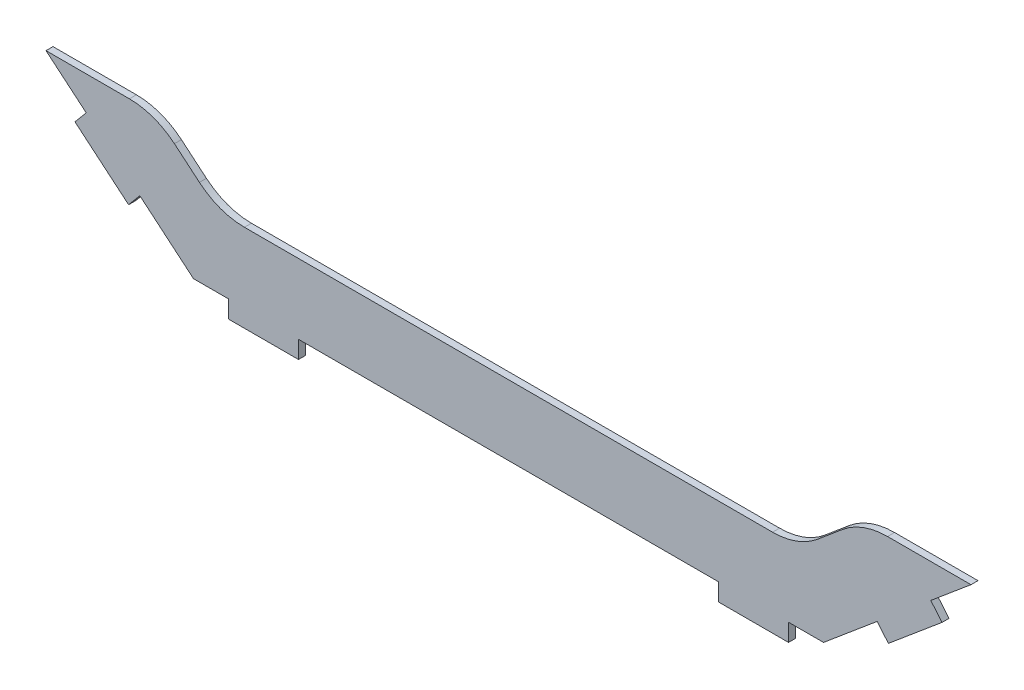
ISO-10303-21;
HEADER;
FILE_DESCRIPTION(('STEP AP214'),'2;1');
FILE_NAME('part.step','',(''),(''),'','','');
FILE_SCHEMA(('AUTOMOTIVE_DESIGN { 1 0 10303 214 1 1 1 1 }'));
ENDSEC;
DATA;
#1=APPLICATION_CONTEXT('core data for automotive mechanical design processes');
#2=APPLICATION_PROTOCOL_DEFINITION('international standard','automotive_design',2000,#1);
#3=PRODUCT_CONTEXT('',#1,'mechanical');
#4=PRODUCT('Part','Part','',(#3));
#5=PRODUCT_RELATED_PRODUCT_CATEGORY('part','',(#4));
#6=PRODUCT_DEFINITION_FORMATION('','',#4);
#7=PRODUCT_DEFINITION_CONTEXT('part definition',#1,'design');
#8=PRODUCT_DEFINITION('design','',#6,#7);
#9=PRODUCT_DEFINITION_SHAPE('','',#8);
#10=(LENGTH_UNIT() NAMED_UNIT(*) SI_UNIT(.MILLI.,.METRE.));
#11=(NAMED_UNIT(*) PLANE_ANGLE_UNIT() SI_UNIT($,.RADIAN.));
#12=(NAMED_UNIT(*) SI_UNIT($,.STERADIAN.) SOLID_ANGLE_UNIT());
#13=UNCERTAINTY_MEASURE_WITH_UNIT(LENGTH_MEASURE(1.E-05),#10,'distance_accuracy_value','');
#14=(GEOMETRIC_REPRESENTATION_CONTEXT(3) GLOBAL_UNCERTAINTY_ASSIGNED_CONTEXT((#13)) GLOBAL_UNIT_ASSIGNED_CONTEXT((#10,
#11,#12)) REPRESENTATION_CONTEXT('',''));
#15=CARTESIAN_POINT('',(0.,0.,0.));
#16=DIRECTION('',(0.,0.,1.));
#17=DIRECTION('',(1.,0.,0.));
#18=AXIS2_PLACEMENT_3D('',#15,#16,#17);
#19=CARTESIAN_POINT('',(0.,0.,0.05));
#20=DIRECTION('',(0.,1.,0.));
#21=DIRECTION('',(0.,0.,1.));
#22=AXIS2_PLACEMENT_3D('',#19,#20,#21);
#23=PLANE('',#22);
#24=DIRECTION('',(1.,0.,0.));
#25=VECTOR('',#24,1.);
#26=CARTESIAN_POINT('',(0.,0.,-0.05));
#27=LINE('',#26,#25);
#28=CARTESIAN_POINT('',(-3.,0.,-0.05));
#29=VERTEX_POINT('',#28);
#30=CARTESIAN_POINT('',(3.,0.,-0.05));
#31=VERTEX_POINT('',#30);
#32=EDGE_CURVE('E277',#29,#31,#27,.T.);
#33=ORIENTED_EDGE('',*,*,#32,.T.);
#34=DIRECTION('',(0.,0.,-1.));
#35=VECTOR('',#34,1.);
#36=CARTESIAN_POINT('',(3.,0.,0.05));
#37=LINE('',#36,#35);
#38=CARTESIAN_POINT('',(3.,0.,0.05));
#39=VERTEX_POINT('',#38);
#40=EDGE_CURVE('E276',#39,#31,#37,.T.);
#41=ORIENTED_EDGE('',*,*,#40,.F.);
#42=DIRECTION('',(1.,0.,0.));
#43=VECTOR('',#42,1.);
#44=CARTESIAN_POINT('',(0.,0.,0.05));
#45=LINE('',#44,#43);
#46=CARTESIAN_POINT('',(-3.,0.,0.05));
#47=VERTEX_POINT('',#46);
#48=EDGE_CURVE('E260',#47,#39,#45,.T.);
#49=ORIENTED_EDGE('',*,*,#48,.F.);
#50=DIRECTION('',(0.,0.,-1.));
#51=VECTOR('',#50,1.);
#52=CARTESIAN_POINT('',(-3.,0.,0.05));
#53=LINE('',#52,#51);
#54=EDGE_CURVE('E350',#47,#29,#53,.T.);
#55=ORIENTED_EDGE('',*,*,#54,.T.);
#56=EDGE_LOOP('',(#33,#41,#49,#55));
#57=FACE_BOUND('',#56,.T.);
#58=ADVANCED_FACE('F39',(#57),#23,.F.);
#59=CARTESIAN_POINT('',(3.,0.,0.05));
#60=DIRECTION('',(1.,0.,0.));
#61=DIRECTION('',(0.,0.,-1.));
#62=AXIS2_PLACEMENT_3D('',#59,#60,#61);
#63=PLANE('',#62);
#64=DIRECTION('',(0.,-1.,0.));
#65=VECTOR('',#64,1.);
#66=CARTESIAN_POINT('',(3.,0.,-0.05));
#67=LINE('',#66,#65);
#68=CARTESIAN_POINT('',(3.,-0.25,-0.05));
#69=VERTEX_POINT('',#68);
#70=EDGE_CURVE('E353',#31,#69,#67,.T.);
#71=ORIENTED_EDGE('',*,*,#70,.T.);
#72=DIRECTION('',(0.,0.,-1.));
#73=VECTOR('',#72,1.);
#74=CARTESIAN_POINT('',(3.,-0.25,0.05));
#75=LINE('',#74,#73);
#76=CARTESIAN_POINT('',(3.,-0.25,0.05));
#77=VERTEX_POINT('',#76);
#78=EDGE_CURVE('E281',#77,#69,#75,.T.);
#79=ORIENTED_EDGE('',*,*,#78,.F.);
#80=DIRECTION('',(0.,-1.,0.));
#81=VECTOR('',#80,1.);
#82=CARTESIAN_POINT('',(3.,0.,0.05));
#83=LINE('',#82,#81);
#84=EDGE_CURVE('E265',#39,#77,#83,.T.);
#85=ORIENTED_EDGE('',*,*,#84,.F.);
#86=ORIENTED_EDGE('',*,*,#40,.T.);
#87=EDGE_LOOP('',(#71,#79,#85,#86));
#88=FACE_BOUND('',#87,.T.);
#89=ADVANCED_FACE('F283',(#88),#63,.F.);
#90=CARTESIAN_POINT('',(3.,-0.25,0.05));
#91=DIRECTION('',(0.,1.,0.));
#92=DIRECTION('',(0.,0.,1.));
#93=AXIS2_PLACEMENT_3D('',#90,#91,#92);
#94=PLANE('',#93);
#95=DIRECTION('',(1.,0.,0.));
#96=VECTOR('',#95,1.);
#97=CARTESIAN_POINT('',(3.,-0.25,-0.05));
#98=LINE('',#97,#96);
#99=CARTESIAN_POINT('',(4.,-0.25,-0.05));
#100=VERTEX_POINT('',#99);
#101=EDGE_CURVE('E355',#69,#100,#98,.T.);
#102=ORIENTED_EDGE('',*,*,#101,.T.);
#103=DIRECTION('',(0.,0.,-1.));
#104=VECTOR('',#103,1.);
#105=CARTESIAN_POINT('',(4.,-0.25,0.05));
#106=LINE('',#105,#104);
#107=CARTESIAN_POINT('',(4.,-0.25,0.05));
#108=VERTEX_POINT('',#107);
#109=EDGE_CURVE('E479',#108,#100,#106,.T.);
#110=ORIENTED_EDGE('',*,*,#109,.F.);
#111=DIRECTION('',(1.,0.,0.));
#112=VECTOR('',#111,1.);
#113=CARTESIAN_POINT('',(3.,-0.25,0.05));
#114=LINE('',#113,#112);
#115=EDGE_CURVE('E286',#77,#108,#114,.T.);
#116=ORIENTED_EDGE('',*,*,#115,.F.);
#117=ORIENTED_EDGE('',*,*,#78,.T.);
#118=EDGE_LOOP('',(#102,#110,#116,#117));
#119=FACE_BOUND('',#118,.T.);
#120=ADVANCED_FACE('F592',(#119),#94,.F.);
#121=CARTESIAN_POINT('',(4.,-0.25,0.05));
#122=DIRECTION('',(-1.,0.,0.));
#123=DIRECTION('',(0.,0.,1.));
#124=AXIS2_PLACEMENT_3D('',#121,#122,#123);
#125=PLANE('',#124);
#126=DIRECTION('',(0.,1.,0.));
#127=VECTOR('',#126,1.);
#128=CARTESIAN_POINT('',(4.,-0.25,-0.05));
#129=LINE('',#128,#127);
#130=CARTESIAN_POINT('',(4.,0.,-0.05));
#131=VERTEX_POINT('',#130);
#132=EDGE_CURVE('E357',#100,#131,#129,.T.);
#133=ORIENTED_EDGE('',*,*,#132,.T.);
#134=DIRECTION('',(0.,0.,-1.));
#135=VECTOR('',#134,1.);
#136=CARTESIAN_POINT('',(4.,0.,0.05));
#137=LINE('',#136,#135);
#138=CARTESIAN_POINT('',(4.,0.,0.05));
#139=VERTEX_POINT('',#138);
#140=EDGE_CURVE('E475',#139,#131,#137,.T.);
#141=ORIENTED_EDGE('',*,*,#140,.F.);
#142=DIRECTION('',(0.,1.,0.));
#143=VECTOR('',#142,1.);
#144=CARTESIAN_POINT('',(4.,-0.25,0.05));
#145=LINE('',#144,#143);
#146=EDGE_CURVE('E288',#108,#139,#145,.T.);
#147=ORIENTED_EDGE('',*,*,#146,.F.);
#148=ORIENTED_EDGE('',*,*,#109,.T.);
#149=EDGE_LOOP('',(#133,#141,#147,#148));
#150=FACE_BOUND('',#149,.T.);
#151=ADVANCED_FACE('F599',(#150),#125,.F.);
#152=CARTESIAN_POINT('',(4.,0.,0.05));
#153=DIRECTION('',(0.,1.,0.));
#154=DIRECTION('',(0.,0.,1.));
#155=AXIS2_PLACEMENT_3D('',#152,#153,#154);
#156=PLANE('',#155);
#157=DIRECTION('',(1.,0.,0.));
#158=VECTOR('',#157,1.);
#159=CARTESIAN_POINT('',(4.,0.,-0.05));
#160=LINE('',#159,#158);
#161=CARTESIAN_POINT('',(4.5,0.,-0.05));
#162=VERTEX_POINT('',#161);
#163=EDGE_CURVE('E360',#131,#162,#160,.T.);
#164=ORIENTED_EDGE('',*,*,#163,.T.);
#165=DIRECTION('',(0.,0.,-1.));
#166=VECTOR('',#165,1.);
#167=CARTESIAN_POINT('',(4.5,0.,0.05));
#168=LINE('',#167,#166);
#169=CARTESIAN_POINT('',(4.5,0.,0.05));
#170=VERTEX_POINT('',#169);
#171=EDGE_CURVE('E471',#170,#162,#168,.T.);
#172=ORIENTED_EDGE('',*,*,#171,.F.);
#173=DIRECTION('',(1.,0.,0.));
#174=VECTOR('',#173,1.);
#175=CARTESIAN_POINT('',(4.,0.,0.05));
#176=LINE('',#175,#174);
#177=EDGE_CURVE('E293',#139,#170,#176,.T.);
#178=ORIENTED_EDGE('',*,*,#177,.F.);
#179=ORIENTED_EDGE('',*,*,#140,.T.);
#180=EDGE_LOOP('',(#164,#172,#178,#179));
#181=FACE_BOUND('',#180,.T.);
#182=ADVANCED_FACE('F602',(#181),#156,.F.);
#183=CARTESIAN_POINT('',(4.5,0.,0.05));
#184=DIRECTION('',(-0.64278760968654,0.766044443118977,0.));
#185=DIRECTION('',(-0.766044443118977,-0.64278760968654,0.));
#186=AXIS2_PLACEMENT_3D('',#183,#184,#185);
#187=PLANE('',#186);
#188=DIRECTION('',(0.766044443118977,0.64278760968654,0.));
#189=VECTOR('',#188,1.);
#190=CARTESIAN_POINT('',(4.5,0.,-0.05));
#191=LINE('',#190,#189);
#192=CARTESIAN_POINT('',(5.26604444311898,0.642787609686539,-0.05));
#193=VERTEX_POINT('',#192);
#194=EDGE_CURVE('E363',#162,#193,#191,.T.);
#195=ORIENTED_EDGE('',*,*,#194,.T.);
#196=DIRECTION('',(0.,0.,-1.));
#197=VECTOR('',#196,1.);
#198=CARTESIAN_POINT('',(5.26604444311898,0.642787609686539,0.05));
#199=LINE('',#198,#197);
#200=CARTESIAN_POINT('',(5.26604444311898,0.642787609686539,0.05));
#201=VERTEX_POINT('',#200);
#202=EDGE_CURVE('E467',#201,#193,#199,.T.);
#203=ORIENTED_EDGE('',*,*,#202,.F.);
#204=DIRECTION('',(0.766044443118977,0.64278760968654,0.));
#205=VECTOR('',#204,1.);
#206=CARTESIAN_POINT('',(4.5,0.,0.05));
#207=LINE('',#206,#205);
#208=EDGE_CURVE('E296',#170,#201,#207,.T.);
#209=ORIENTED_EDGE('',*,*,#208,.F.);
#210=ORIENTED_EDGE('',*,*,#171,.T.);
#211=EDGE_LOOP('',(#195,#203,#209,#210));
#212=FACE_BOUND('',#211,.T.);
#213=ADVANCED_FACE('F607',(#212),#187,.F.);
#214=CARTESIAN_POINT('',(5.26604444311898,0.642787609686539,0.05));
#215=DIRECTION('',(0.766044443118977,0.642787609686541,0.));
#216=DIRECTION('',(-0.642787609686541,0.766044443118977,0.));
#217=AXIS2_PLACEMENT_3D('',#214,#215,#216);
#218=PLANE('',#217);
#219=DIRECTION('',(0.642787609686541,-0.766044443118977,0.));
#220=VECTOR('',#219,1.);
#221=CARTESIAN_POINT('',(5.26604444311898,0.642787609686539,-0.05));
#222=LINE('',#221,#220);
#223=CARTESIAN_POINT('',(5.42674134554061,0.451276498906795,-0.05));
#224=VERTEX_POINT('',#223);
#225=EDGE_CURVE('E366',#193,#224,#222,.T.);
#226=ORIENTED_EDGE('',*,*,#225,.T.);
#227=DIRECTION('',(0.,0.,-1.));
#228=VECTOR('',#227,1.);
#229=CARTESIAN_POINT('',(5.42674134554061,0.451276498906795,0.05));
#230=LINE('',#229,#228);
#231=CARTESIAN_POINT('',(5.42674134554061,0.451276498906795,0.05));
#232=VERTEX_POINT('',#231);
#233=EDGE_CURVE('E463',#232,#224,#230,.T.);
#234=ORIENTED_EDGE('',*,*,#233,.F.);
#235=DIRECTION('',(0.642787609686541,-0.766044443118977,0.));
#236=VECTOR('',#235,1.);
#237=CARTESIAN_POINT('',(5.26604444311898,0.642787609686539,0.05));
#238=LINE('',#237,#236);
#239=EDGE_CURVE('E299',#201,#232,#238,.T.);
#240=ORIENTED_EDGE('',*,*,#239,.F.);
#241=ORIENTED_EDGE('',*,*,#202,.T.);
#242=EDGE_LOOP('',(#226,#234,#240,#241));
#243=FACE_BOUND('',#242,.T.);
#244=ADVANCED_FACE('F613',(#243),#218,.F.);
#245=CARTESIAN_POINT('',(5.42674134554061,0.451276498906795,0.05));
#246=DIRECTION('',(-0.64278760968654,0.766044443118977,0.));
#247=DIRECTION('',(-0.766044443118977,-0.64278760968654,0.));
#248=AXIS2_PLACEMENT_3D('',#245,#246,#247);
#249=PLANE('',#248);
#250=DIRECTION('',(0.766044443118977,0.64278760968654,0.));
#251=VECTOR('',#250,1.);
#252=CARTESIAN_POINT('',(5.42674134554061,0.451276498906795,-0.05));
#253=LINE('',#252,#251);
#254=CARTESIAN_POINT('',(6.19278578865959,1.09406410859334,-0.05));
#255=VERTEX_POINT('',#254);
#256=EDGE_CURVE('E369',#224,#255,#253,.T.);
#257=ORIENTED_EDGE('',*,*,#256,.T.);
#258=DIRECTION('',(0.,0.,-1.));
#259=VECTOR('',#258,1.);
#260=CARTESIAN_POINT('',(6.19278578865959,1.09406410859334,0.05));
#261=LINE('',#260,#259);
#262=CARTESIAN_POINT('',(6.19278578865959,1.09406410859334,0.05));
#263=VERTEX_POINT('',#262);
#264=EDGE_CURVE('E459',#263,#255,#261,.T.);
#265=ORIENTED_EDGE('',*,*,#264,.F.);
#266=DIRECTION('',(0.766044443118977,0.64278760968654,0.));
#267=VECTOR('',#266,1.);
#268=CARTESIAN_POINT('',(5.42674134554061,0.451276498906795,0.05));
#269=LINE('',#268,#267);
#270=EDGE_CURVE('E302',#232,#263,#269,.T.);
#271=ORIENTED_EDGE('',*,*,#270,.F.);
#272=ORIENTED_EDGE('',*,*,#233,.T.);
#273=EDGE_LOOP('',(#257,#265,#271,#272));
#274=FACE_BOUND('',#273,.T.);
#275=ADVANCED_FACE('F617',(#274),#249,.F.);
#276=CARTESIAN_POINT('',(6.19278578865959,1.09406410859334,0.05));
#277=DIRECTION('',(-0.766044443118978,-0.64278760968654,0.));
#278=DIRECTION('',(0.64278760968654,-0.766044443118978,0.));
#279=AXIS2_PLACEMENT_3D('',#276,#277,#278);
#280=PLANE('',#279);
#281=DIRECTION('',(-0.64278760968654,0.766044443118978,0.));
#282=VECTOR('',#281,1.);
#283=CARTESIAN_POINT('',(6.19278578865959,1.09406410859334,-0.05));
#284=LINE('',#283,#282);
#285=CARTESIAN_POINT('',(6.03208888623795,1.28557521937308,-0.05));
#286=VERTEX_POINT('',#285);
#287=EDGE_CURVE('E372',#255,#286,#284,.T.);
#288=ORIENTED_EDGE('',*,*,#287,.T.);
#289=DIRECTION('',(0.,0.,-1.));
#290=VECTOR('',#289,1.);
#291=CARTESIAN_POINT('',(6.03208888623795,1.28557521937308,0.05));
#292=LINE('',#291,#290);
#293=CARTESIAN_POINT('',(6.03208888623795,1.28557521937308,0.05));
#294=VERTEX_POINT('',#293);
#295=EDGE_CURVE('E455',#294,#286,#292,.T.);
#296=ORIENTED_EDGE('',*,*,#295,.F.);
#297=DIRECTION('',(-0.64278760968654,0.766044443118978,0.));
#298=VECTOR('',#297,1.);
#299=CARTESIAN_POINT('',(6.19278578865959,1.09406410859334,0.05));
#300=LINE('',#299,#298);
#301=EDGE_CURVE('E305',#263,#294,#300,.T.);
#302=ORIENTED_EDGE('',*,*,#301,.F.);
#303=ORIENTED_EDGE('',*,*,#264,.T.);
#304=EDGE_LOOP('',(#288,#296,#302,#303));
#305=FACE_BOUND('',#304,.T.);
#306=ADVANCED_FACE('F622',(#305),#280,.F.);
#307=CARTESIAN_POINT('',(6.03208888623795,1.28557521937308,0.05));
#308=DIRECTION('',(-0.642787609686542,0.766044443118976,0.));
#309=DIRECTION('',(-0.766044443118976,-0.642787609686542,0.));
#310=AXIS2_PLACEMENT_3D('',#307,#308,#309);
#311=PLANE('',#310);
#312=DIRECTION('',(0.766044443118976,0.642787609686542,0.));
#313=VECTOR('',#312,1.);
#314=CARTESIAN_POINT('',(6.03208888623795,1.28557521937308,-0.05));
#315=LINE('',#314,#313);
#316=CARTESIAN_POINT('',(6.60662221857719,1.76766592663799,-0.05));
#317=VERTEX_POINT('',#316);
#318=EDGE_CURVE('E375',#286,#317,#315,.T.);
#319=ORIENTED_EDGE('',*,*,#318,.T.);
#320=DIRECTION('',(0.,0.,-1.));
#321=VECTOR('',#320,1.);
#322=CARTESIAN_POINT('',(6.60662221857719,1.76766592663799,0.05));
#323=LINE('',#322,#321);
#324=CARTESIAN_POINT('',(6.60662221857719,1.76766592663799,0.05));
#325=VERTEX_POINT('',#324);
#326=EDGE_CURVE('E452',#325,#317,#323,.T.);
#327=ORIENTED_EDGE('',*,*,#326,.F.);
#328=DIRECTION('',(0.766044443118976,0.642787609686542,0.));
#329=VECTOR('',#328,1.);
#330=CARTESIAN_POINT('',(6.03208888623795,1.28557521937308,0.05));
#331=LINE('',#330,#329);
#332=EDGE_CURVE('E308',#294,#325,#331,.T.);
#333=ORIENTED_EDGE('',*,*,#332,.F.);
#334=ORIENTED_EDGE('',*,*,#295,.T.);
#335=EDGE_LOOP('',(#319,#327,#333,#334));
#336=FACE_BOUND('',#335,.T.);
#337=ADVANCED_FACE('F628',(#336),#311,.F.);
#338=CARTESIAN_POINT('',(6.60662221857719,1.76766592663799,0.05));
#339=DIRECTION('',(0.,-1.,0.));
#340=DIRECTION('',(0.,0.,-1.));
#341=AXIS2_PLACEMENT_3D('',#338,#339,#340);
#342=PLANE('',#341);
#343=DIRECTION('',(-1.,0.,0.));
#344=VECTOR('',#343,1.);
#345=CARTESIAN_POINT('',(6.60662221857719,1.76766592663799,-0.05));
#346=LINE('',#345,#344);
#347=CARTESIAN_POINT('',(5.41486862598298,1.76766592663799,-0.05));
#348=VERTEX_POINT('',#347);
#349=EDGE_CURVE('E378',#317,#348,#346,.T.);
#350=ORIENTED_EDGE('',*,*,#349,.T.);
#351=DIRECTION('',(0.,0.,-1.));
#352=VECTOR('',#351,1.);
#353=CARTESIAN_POINT('',(5.41486862598298,1.76766592663799,0.05));
#354=LINE('',#353,#352);
#355=CARTESIAN_POINT('',(5.41486862598298,1.76766592663799,0.05));
#356=VERTEX_POINT('',#355);
#357=EDGE_CURVE('E501',#348,#356,#354,.F.);
#358=ORIENTED_EDGE('',*,*,#357,.T.);
#359=DIRECTION('',(-1.,0.,0.));
#360=VECTOR('',#359,1.);
#361=CARTESIAN_POINT('',(6.60662221857719,1.76766592663799,0.05));
#362=LINE('',#361,#360);
#363=EDGE_CURVE('E311',#325,#356,#362,.T.);
#364=ORIENTED_EDGE('',*,*,#363,.F.);
#365=ORIENTED_EDGE('',*,*,#326,.T.);
#366=EDGE_LOOP('',(#350,#358,#364,#365));
#367=FACE_BOUND('',#366,.T.);
#368=ADVANCED_FACE('F632',(#367),#342,.F.);
#369=CARTESIAN_POINT('',(5.05089839171678,1.76766592663799,0.05));
#370=DIRECTION('',(0.642787609686541,-0.766044443118977,0.));
#371=DIRECTION('',(0.766044443118977,0.642787609686541,0.));
#372=AXIS2_PLACEMENT_3D('',#369,#370,#371);
#373=PLANE('',#372);
#374=DIRECTION('',(-0.766044443118977,-0.642787609686541,0.));
#375=VECTOR('',#374,1.);
#376=CARTESIAN_POINT('',(5.05089839171678,1.76766592663799,-0.05));
#377=LINE('',#376,#375);
#378=CARTESIAN_POINT('',(4.77208101629644,1.53371036975696,-0.05));
#379=VERTEX_POINT('',#378);
#380=CARTESIAN_POINT('',(4.41484714115414,1.23395555688102,-0.05));
#381=VERTEX_POINT('',#380);
#382=EDGE_CURVE('E382',#379,#381,#377,.T.);
#383=ORIENTED_EDGE('',*,*,#382,.T.);
#384=DIRECTION('',(0.,0.,-1.));
#385=VECTOR('',#384,1.);
#386=CARTESIAN_POINT('',(4.41484714115414,1.23395555688102,0.05));
#387=LINE('',#386,#385);
#388=CARTESIAN_POINT('',(4.41484714115414,1.23395555688102,0.05));
#389=VERTEX_POINT('',#388);
#390=EDGE_CURVE('E492',#381,#389,#387,.F.);
#391=ORIENTED_EDGE('',*,*,#390,.T.);
#392=DIRECTION('',(-0.766044443118977,-0.642787609686541,0.));
#393=VECTOR('',#392,1.);
#394=CARTESIAN_POINT('',(5.05089839171678,1.76766592663799,0.05));
#395=LINE('',#394,#393);
#396=CARTESIAN_POINT('',(4.77208101629644,1.53371036975696,0.05));
#397=VERTEX_POINT('',#396);
#398=EDGE_CURVE('E314',#397,#389,#395,.T.);
#399=ORIENTED_EDGE('',*,*,#398,.F.);
#400=DIRECTION('',(0.,0.,-1.));
#401=VECTOR('',#400,1.);
#402=CARTESIAN_POINT('',(4.77208101629644,1.53371036975696,0.05));
#403=LINE('',#402,#401);
#404=EDGE_CURVE('E488',#397,#379,#403,.T.);
#405=ORIENTED_EDGE('',*,*,#404,.T.);
#406=EDGE_LOOP('',(#383,#391,#399,#405));
#407=FACE_BOUND('',#406,.T.);
#408=ADVANCED_FACE('F640',(#407),#373,.F.);
#409=CARTESIAN_POINT('',(4.1360297657338,1.,0.05));
#410=DIRECTION('',(0.,-1.,0.));
#411=DIRECTION('',(1.,0.,0.));
#412=AXIS2_PLACEMENT_3D('',#409,#410,#411);
#413=PLANE('',#412);
#414=DIRECTION('',(-1.,0.,0.));
#415=VECTOR('',#414,1.);
#416=CARTESIAN_POINT('',(4.1360297657338,1.,0.05));
#417=LINE('',#416,#415);
#418=CARTESIAN_POINT('',(3.7720595314676,1.,0.05));
#419=VERTEX_POINT('',#418);
#420=CARTESIAN_POINT('',(-3.77205953146759,0.999999999999999,0.05));
#421=VERTEX_POINT('',#420);
#422=EDGE_CURVE('E318',#419,#421,#417,.T.);
#423=ORIENTED_EDGE('',*,*,#422,.F.);
#424=DIRECTION('',(0.,0.,-1.));
#425=VECTOR('',#424,1.);
#426=CARTESIAN_POINT('',(3.7720595314676,1.,-0.05));
#427=LINE('',#426,#425);
#428=CARTESIAN_POINT('',(3.7720595314676,1.,-0.05));
#429=VERTEX_POINT('',#428);
#430=EDGE_CURVE('E484',#419,#429,#427,.T.);
#431=ORIENTED_EDGE('',*,*,#430,.T.);
#432=DIRECTION('',(-1.,0.,0.));
#433=VECTOR('',#432,1.);
#434=CARTESIAN_POINT('',(4.1360297657338,1.,-0.05));
#435=LINE('',#434,#433);
#436=CARTESIAN_POINT('',(-3.77205953146759,0.999999999999999,-0.05));
#437=VERTEX_POINT('',#436);
#438=EDGE_CURVE('E386',#429,#437,#435,.T.);
#439=ORIENTED_EDGE('',*,*,#438,.T.);
#440=DIRECTION('',(0.,0.,-1.));
#441=VECTOR('',#440,1.);
#442=CARTESIAN_POINT('',(-3.77205953146759,0.999999999999999,0.05));
#443=LINE('',#442,#441);
#444=EDGE_CURVE('E280',#437,#421,#443,.F.);
#445=ORIENTED_EDGE('',*,*,#444,.T.);
#446=EDGE_LOOP('',(#423,#431,#439,#445));
#447=FACE_BOUND('',#446,.T.);
#448=ADVANCED_FACE('F535',(#447),#413,.F.);
#449=CARTESIAN_POINT('',(-5.05089839171678,1.76766592663798,0.05));
#450=DIRECTION('',(-0.64278760968654,-0.766044443118977,0.));
#451=DIRECTION('',(0.766044443118977,-0.64278760968654,0.));
#452=AXIS2_PLACEMENT_3D('',#449,#450,#451);
#453=PLANE('',#452);
#454=DIRECTION('',(-0.766044443118977,0.64278760968654,0.));
#455=VECTOR('',#454,1.);
#456=CARTESIAN_POINT('',(-5.05089839171678,1.76766592663798,0.05));
#457=LINE('',#456,#455);
#458=CARTESIAN_POINT('',(-4.41484714115413,1.23395555688102,0.05));
#459=VERTEX_POINT('',#458);
#460=CARTESIAN_POINT('',(-4.77208101629644,1.53371036975696,0.05));
#461=VERTEX_POINT('',#460);
#462=EDGE_CURVE('E322',#459,#461,#457,.T.);
#463=ORIENTED_EDGE('',*,*,#462,.F.);
#464=DIRECTION('',(0.,0.,-1.));
#465=VECTOR('',#464,1.);
#466=CARTESIAN_POINT('',(-4.41484714115413,1.23395555688102,-0.05));
#467=LINE('',#466,#465);
#468=CARTESIAN_POINT('',(-4.41484714115413,1.23395555688102,-0.05));
#469=VERTEX_POINT('',#468);
#470=EDGE_CURVE('E511',#459,#469,#467,.T.);
#471=ORIENTED_EDGE('',*,*,#470,.T.);
#472=DIRECTION('',(-0.766044443118977,0.64278760968654,0.));
#473=VECTOR('',#472,1.);
#474=CARTESIAN_POINT('',(-5.05089839171678,1.76766592663798,-0.05));
#475=LINE('',#474,#473);
#476=CARTESIAN_POINT('',(-4.77208101629644,1.53371036975696,-0.05));
#477=VERTEX_POINT('',#476);
#478=EDGE_CURVE('E390',#469,#477,#475,.T.);
#479=ORIENTED_EDGE('',*,*,#478,.T.);
#480=DIRECTION('',(0.,0.,-1.));
#481=VECTOR('',#480,1.);
#482=CARTESIAN_POINT('',(-4.77208101629644,1.53371036975696,0.05));
#483=LINE('',#482,#481);
#484=EDGE_CURVE('E69',#477,#461,#483,.F.);
#485=ORIENTED_EDGE('',*,*,#484,.T.);
#486=EDGE_LOOP('',(#463,#471,#479,#485));
#487=FACE_BOUND('',#486,.T.);
#488=ADVANCED_FACE('F539',(#487),#453,.F.);
#489=CARTESIAN_POINT('',(-6.60662221857719,1.76766592663798,0.05));
#490=DIRECTION('',(0.,-1.,0.));
#491=DIRECTION('',(1.,0.,0.));
#492=AXIS2_PLACEMENT_3D('',#489,#490,#491);
#493=PLANE('',#492);
#494=DIRECTION('',(-1.,0.,0.));
#495=VECTOR('',#494,1.);
#496=CARTESIAN_POINT('',(-6.60662221857719,1.76766592663798,0.05));
#497=LINE('',#496,#495);
#498=CARTESIAN_POINT('',(-5.41486862598298,1.76766592663798,0.05));
#499=VERTEX_POINT('',#498);
#500=CARTESIAN_POINT('',(-6.60662221857719,1.76766592663798,0.05));
#501=VERTEX_POINT('',#500);
#502=EDGE_CURVE('E325',#499,#501,#497,.T.);
#503=ORIENTED_EDGE('',*,*,#502,.F.);
#504=DIRECTION('',(0.,0.,-1.));
#505=VECTOR('',#504,1.);
#506=CARTESIAN_POINT('',(-5.41486862598298,1.76766592663798,0.05));
#507=LINE('',#506,#505);
#508=CARTESIAN_POINT('',(-5.41486862598298,1.76766592663798,-0.05));
#509=VERTEX_POINT('',#508);
#510=EDGE_CURVE('E515',#499,#509,#507,.T.);
#511=ORIENTED_EDGE('',*,*,#510,.T.);
#512=DIRECTION('',(-1.,0.,0.));
#513=VECTOR('',#512,1.);
#514=CARTESIAN_POINT('',(-6.60662221857719,1.76766592663798,-0.05));
#515=LINE('',#514,#513);
#516=CARTESIAN_POINT('',(-6.60662221857719,1.76766592663798,-0.05));
#517=VERTEX_POINT('',#516);
#518=EDGE_CURVE('E393',#509,#517,#515,.T.);
#519=ORIENTED_EDGE('',*,*,#518,.T.);
#520=DIRECTION('',(0.,0.,-1.));
#521=VECTOR('',#520,1.);
#522=CARTESIAN_POINT('',(-6.60662221857719,1.76766592663798,0.05));
#523=LINE('',#522,#521);
#524=EDGE_CURVE('E448',#501,#517,#523,.T.);
#525=ORIENTED_EDGE('',*,*,#524,.F.);
#526=EDGE_LOOP('',(#503,#511,#519,#525));
#527=FACE_BOUND('',#526,.T.);
#528=ADVANCED_FACE('F544',(#527),#493,.F.);
#529=CARTESIAN_POINT('',(-6.03208888623795,1.28557521937308,0.05));
#530=DIRECTION('',(0.64278760968654,0.766044443118977,0.));
#531=DIRECTION('',(-0.766044443118977,0.64278760968654,0.));
#532=AXIS2_PLACEMENT_3D('',#529,#530,#531);
#533=PLANE('',#532);
#534=DIRECTION('',(0.766044443118977,-0.64278760968654,0.));
#535=VECTOR('',#534,1.);
#536=CARTESIAN_POINT('',(-6.03208888623795,1.28557521937308,-0.05));
#537=LINE('',#536,#535);
#538=CARTESIAN_POINT('',(-6.03208888623795,1.28557521937308,-0.05));
#539=VERTEX_POINT('',#538);
#540=EDGE_CURVE('E396',#517,#539,#537,.T.);
#541=ORIENTED_EDGE('',*,*,#540,.T.);
#542=DIRECTION('',(0.,0.,-1.));
#543=VECTOR('',#542,1.);
#544=CARTESIAN_POINT('',(-6.03208888623795,1.28557521937308,0.05));
#545=LINE('',#544,#543);
#546=CARTESIAN_POINT('',(-6.03208888623795,1.28557521937308,0.05));
#547=VERTEX_POINT('',#546);
#548=EDGE_CURVE('E444',#547,#539,#545,.T.);
#549=ORIENTED_EDGE('',*,*,#548,.F.);
#550=DIRECTION('',(0.766044443118977,-0.64278760968654,0.));
#551=VECTOR('',#550,1.);
#552=CARTESIAN_POINT('',(-6.03208888623795,1.28557521937308,0.05));
#553=LINE('',#552,#551);
#554=EDGE_CURVE('E328',#501,#547,#553,.T.);
#555=ORIENTED_EDGE('',*,*,#554,.F.);
#556=ORIENTED_EDGE('',*,*,#524,.T.);
#557=EDGE_LOOP('',(#541,#549,#555,#556));
#558=FACE_BOUND('',#557,.T.);
#559=ADVANCED_FACE('F551',(#558),#533,.F.);
#560=CARTESIAN_POINT('',(-6.19278578865959,1.09406410859334,0.05));
#561=DIRECTION('',(0.766044443118977,-0.64278760968654,0.));
#562=DIRECTION('',(0.64278760968654,0.766044443118978,0.));
#563=AXIS2_PLACEMENT_3D('',#560,#561,#562);
#564=PLANE('',#563);
#565=DIRECTION('',(-0.64278760968654,-0.766044443118977,0.));
#566=VECTOR('',#565,1.);
#567=CARTESIAN_POINT('',(-6.19278578865959,1.09406410859334,-0.05));
#568=LINE('',#567,#566);
#569=CARTESIAN_POINT('',(-6.19278578865959,1.09406410859334,-0.05));
#570=VERTEX_POINT('',#569);
#571=EDGE_CURVE('E399',#539,#570,#568,.T.);
#572=ORIENTED_EDGE('',*,*,#571,.T.);
#573=DIRECTION('',(0.,0.,-1.));
#574=VECTOR('',#573,1.);
#575=CARTESIAN_POINT('',(-6.19278578865959,1.09406410859334,0.05));
#576=LINE('',#575,#574);
#577=CARTESIAN_POINT('',(-6.19278578865959,1.09406410859334,0.05));
#578=VERTEX_POINT('',#577);
#579=EDGE_CURVE('E440',#578,#570,#576,.T.);
#580=ORIENTED_EDGE('',*,*,#579,.F.);
#581=DIRECTION('',(-0.64278760968654,-0.766044443118977,0.));
#582=VECTOR('',#581,1.);
#583=CARTESIAN_POINT('',(-6.19278578865959,1.09406410859334,0.05));
#584=LINE('',#583,#582);
#585=EDGE_CURVE('E331',#547,#578,#584,.T.);
#586=ORIENTED_EDGE('',*,*,#585,.F.);
#587=ORIENTED_EDGE('',*,*,#548,.T.);
#588=EDGE_LOOP('',(#572,#580,#586,#587));
#589=FACE_BOUND('',#588,.T.);
#590=ADVANCED_FACE('F555',(#589),#564,.F.);
#591=CARTESIAN_POINT('',(-5.42674134554061,0.451276498906795,0.05));
#592=DIRECTION('',(0.64278760968654,0.766044443118977,0.));
#593=DIRECTION('',(-0.766044443118977,0.642787609686541,0.));
#594=AXIS2_PLACEMENT_3D('',#591,#592,#593);
#595=PLANE('',#594);
#596=DIRECTION('',(0.766044443118977,-0.642787609686541,0.));
#597=VECTOR('',#596,1.);
#598=CARTESIAN_POINT('',(-5.42674134554061,0.451276498906795,-0.05));
#599=LINE('',#598,#597);
#600=CARTESIAN_POINT('',(-5.42674134554061,0.451276498906795,-0.05));
#601=VERTEX_POINT('',#600);
#602=EDGE_CURVE('E402',#570,#601,#599,.T.);
#603=ORIENTED_EDGE('',*,*,#602,.T.);
#604=DIRECTION('',(0.,0.,-1.));
#605=VECTOR('',#604,1.);
#606=CARTESIAN_POINT('',(-5.42674134554061,0.451276498906795,0.05));
#607=LINE('',#606,#605);
#608=CARTESIAN_POINT('',(-5.42674134554061,0.451276498906795,0.05));
#609=VERTEX_POINT('',#608);
#610=EDGE_CURVE('E436',#609,#601,#607,.T.);
#611=ORIENTED_EDGE('',*,*,#610,.F.);
#612=DIRECTION('',(0.766044443118977,-0.642787609686541,0.));
#613=VECTOR('',#612,1.);
#614=CARTESIAN_POINT('',(-5.42674134554061,0.451276498906795,0.05));
#615=LINE('',#614,#613);
#616=EDGE_CURVE('E334',#578,#609,#615,.T.);
#617=ORIENTED_EDGE('',*,*,#616,.F.);
#618=ORIENTED_EDGE('',*,*,#579,.T.);
#619=EDGE_LOOP('',(#603,#611,#617,#618));
#620=FACE_BOUND('',#619,.T.);
#621=ADVANCED_FACE('F562',(#620),#595,.F.);
#622=CARTESIAN_POINT('',(-5.26604444311898,0.642787609686539,0.05));
#623=DIRECTION('',(-0.766044443118977,0.64278760968654,0.));
#624=DIRECTION('',(-0.64278760968654,-0.766044443118977,0.));
#625=AXIS2_PLACEMENT_3D('',#622,#623,#624);
#626=PLANE('',#625);
#627=DIRECTION('',(0.64278760968654,0.766044443118977,0.));
#628=VECTOR('',#627,1.);
#629=CARTESIAN_POINT('',(-5.26604444311898,0.642787609686539,-0.05));
#630=LINE('',#629,#628);
#631=CARTESIAN_POINT('',(-5.26604444311898,0.642787609686539,-0.05));
#632=VERTEX_POINT('',#631);
#633=EDGE_CURVE('E405',#601,#632,#630,.T.);
#634=ORIENTED_EDGE('',*,*,#633,.T.);
#635=DIRECTION('',(0.,0.,-1.));
#636=VECTOR('',#635,1.);
#637=CARTESIAN_POINT('',(-5.26604444311898,0.642787609686539,0.05));
#638=LINE('',#637,#636);
#639=CARTESIAN_POINT('',(-5.26604444311898,0.642787609686539,0.05));
#640=VERTEX_POINT('',#639);
#641=EDGE_CURVE('E432',#640,#632,#638,.T.);
#642=ORIENTED_EDGE('',*,*,#641,.F.);
#643=DIRECTION('',(0.64278760968654,0.766044443118977,0.));
#644=VECTOR('',#643,1.);
#645=CARTESIAN_POINT('',(-5.26604444311898,0.642787609686539,0.05));
#646=LINE('',#645,#644);
#647=EDGE_CURVE('E337',#609,#640,#646,.T.);
#648=ORIENTED_EDGE('',*,*,#647,.F.);
#649=ORIENTED_EDGE('',*,*,#610,.T.);
#650=EDGE_LOOP('',(#634,#642,#648,#649));
#651=FACE_BOUND('',#650,.T.);
#652=ADVANCED_FACE('F565',(#651),#626,.F.);
#653=CARTESIAN_POINT('',(-4.5,0.,0.05));
#654=DIRECTION('',(0.64278760968654,0.766044443118977,0.));
#655=DIRECTION('',(-0.766044443118977,0.64278760968654,0.));
#656=AXIS2_PLACEMENT_3D('',#653,#654,#655);
#657=PLANE('',#656);
#658=DIRECTION('',(0.766044443118977,-0.64278760968654,0.));
#659=VECTOR('',#658,1.);
#660=CARTESIAN_POINT('',(-4.5,0.,-0.05));
#661=LINE('',#660,#659);
#662=CARTESIAN_POINT('',(-4.5,0.,-0.05));
#663=VERTEX_POINT('',#662);
#664=EDGE_CURVE('E408',#632,#663,#661,.T.);
#665=ORIENTED_EDGE('',*,*,#664,.T.);
#666=DIRECTION('',(0.,0.,-1.));
#667=VECTOR('',#666,1.);
#668=CARTESIAN_POINT('',(-4.5,0.,0.05));
#669=LINE('',#668,#667);
#670=CARTESIAN_POINT('',(-4.5,0.,0.05));
#671=VERTEX_POINT('',#670);
#672=EDGE_CURVE('E429',#671,#663,#669,.T.);
#673=ORIENTED_EDGE('',*,*,#672,.F.);
#674=DIRECTION('',(0.766044443118977,-0.64278760968654,0.));
#675=VECTOR('',#674,1.);
#676=CARTESIAN_POINT('',(-4.5,0.,0.05));
#677=LINE('',#676,#675);
#678=EDGE_CURVE('E340',#640,#671,#677,.T.);
#679=ORIENTED_EDGE('',*,*,#678,.F.);
#680=ORIENTED_EDGE('',*,*,#641,.T.);
#681=EDGE_LOOP('',(#665,#673,#679,#680));
#682=FACE_BOUND('',#681,.T.);
#683=ADVANCED_FACE('F570',(#682),#657,.F.);
#684=CARTESIAN_POINT('',(-4.,0.,0.05));
#685=DIRECTION('',(0.,1.,0.));
#686=DIRECTION('',(-1.,0.,0.));
#687=AXIS2_PLACEMENT_3D('',#684,#685,#686);
#688=PLANE('',#687);
#689=DIRECTION('',(1.,0.,0.));
#690=VECTOR('',#689,1.);
#691=CARTESIAN_POINT('',(-4.,0.,-0.05));
#692=LINE('',#691,#690);
#693=CARTESIAN_POINT('',(-4.,0.,-0.05));
#694=VERTEX_POINT('',#693);
#695=EDGE_CURVE('E411',#663,#694,#692,.T.);
#696=ORIENTED_EDGE('',*,*,#695,.T.);
#697=DIRECTION('',(0.,0.,-1.));
#698=VECTOR('',#697,1.);
#699=CARTESIAN_POINT('',(-4.,0.,0.05));
#700=LINE('',#699,#698);
#701=CARTESIAN_POINT('',(-4.,0.,0.05));
#702=VERTEX_POINT('',#701);
#703=EDGE_CURVE('E426',#702,#694,#700,.T.);
#704=ORIENTED_EDGE('',*,*,#703,.F.);
#705=DIRECTION('',(1.,0.,0.));
#706=VECTOR('',#705,1.);
#707=CARTESIAN_POINT('',(-4.,0.,0.05));
#708=LINE('',#707,#706);
#709=EDGE_CURVE('E343',#671,#702,#708,.T.);
#710=ORIENTED_EDGE('',*,*,#709,.F.);
#711=ORIENTED_EDGE('',*,*,#672,.T.);
#712=EDGE_LOOP('',(#696,#704,#710,#711));
#713=FACE_BOUND('',#712,.T.);
#714=ADVANCED_FACE('F576',(#713),#688,.F.);
#715=CARTESIAN_POINT('',(-4.,-0.25,0.05));
#716=DIRECTION('',(1.,0.,0.));
#717=DIRECTION('',(0.,0.,-1.));
#718=AXIS2_PLACEMENT_3D('',#715,#716,#717);
#719=PLANE('',#718);
#720=DIRECTION('',(0.,-1.,0.));
#721=VECTOR('',#720,1.);
#722=CARTESIAN_POINT('',(-4.,-0.25,-0.05));
#723=LINE('',#722,#721);
#724=CARTESIAN_POINT('',(-4.,-0.25,-0.05));
#725=VERTEX_POINT('',#724);
#726=EDGE_CURVE('E413',#694,#725,#723,.T.);
#727=ORIENTED_EDGE('',*,*,#726,.T.);
#728=DIRECTION('',(0.,0.,-1.));
#729=VECTOR('',#728,1.);
#730=CARTESIAN_POINT('',(-4.,-0.25,0.05));
#731=LINE('',#730,#729);
#732=CARTESIAN_POINT('',(-4.,-0.25,0.05));
#733=VERTEX_POINT('',#732);
#734=EDGE_CURVE('E423',#733,#725,#731,.T.);
#735=ORIENTED_EDGE('',*,*,#734,.F.);
#736=DIRECTION('',(0.,-1.,0.));
#737=VECTOR('',#736,1.);
#738=CARTESIAN_POINT('',(-4.,-0.25,0.05));
#739=LINE('',#738,#737);
#740=EDGE_CURVE('E345',#702,#733,#739,.T.);
#741=ORIENTED_EDGE('',*,*,#740,.F.);
#742=ORIENTED_EDGE('',*,*,#703,.T.);
#743=EDGE_LOOP('',(#727,#735,#741,#742));
#744=FACE_BOUND('',#743,.T.);
#745=ADVANCED_FACE('F580',(#744),#719,.F.);
#746=CARTESIAN_POINT('',(-3.,-0.25,0.05));
#747=DIRECTION('',(0.,1.,0.));
#748=DIRECTION('',(-1.,0.,0.));
#749=AXIS2_PLACEMENT_3D('',#746,#747,#748);
#750=PLANE('',#749);
#751=DIRECTION('',(1.,0.,0.));
#752=VECTOR('',#751,1.);
#753=CARTESIAN_POINT('',(-3.,-0.25,-0.05));
#754=LINE('',#753,#752);
#755=CARTESIAN_POINT('',(-3.,-0.25,-0.05));
#756=VERTEX_POINT('',#755);
#757=EDGE_CURVE('E415',#725,#756,#754,.T.);
#758=ORIENTED_EDGE('',*,*,#757,.T.);
#759=DIRECTION('',(0.,0.,-1.));
#760=VECTOR('',#759,1.);
#761=CARTESIAN_POINT('',(-3.,-0.25,0.05));
#762=LINE('',#761,#760);
#763=CARTESIAN_POINT('',(-3.,-0.25,0.05));
#764=VERTEX_POINT('',#763);
#765=EDGE_CURVE('E420',#764,#756,#762,.T.);
#766=ORIENTED_EDGE('',*,*,#765,.F.);
#767=DIRECTION('',(1.,0.,0.));
#768=VECTOR('',#767,1.);
#769=CARTESIAN_POINT('',(-3.,-0.25,0.05));
#770=LINE('',#769,#768);
#771=EDGE_CURVE('E347',#733,#764,#770,.T.);
#772=ORIENTED_EDGE('',*,*,#771,.F.);
#773=ORIENTED_EDGE('',*,*,#734,.T.);
#774=EDGE_LOOP('',(#758,#766,#772,#773));
#775=FACE_BOUND('',#774,.T.);
#776=ADVANCED_FACE('F585',(#775),#750,.F.);
#777=CARTESIAN_POINT('',(-3.,0.,0.05));
#778=DIRECTION('',(-1.,0.,0.));
#779=DIRECTION('',(0.,0.,1.));
#780=AXIS2_PLACEMENT_3D('',#777,#778,#779);
#781=PLANE('',#780);
#782=DIRECTION('',(0.,1.,0.));
#783=VECTOR('',#782,1.);
#784=CARTESIAN_POINT('',(-3.,0.,-0.05));
#785=LINE('',#784,#783);
#786=EDGE_CURVE('E273',#756,#29,#785,.T.);
#787=ORIENTED_EDGE('',*,*,#786,.T.);
#788=ORIENTED_EDGE('',*,*,#54,.F.);
#789=DIRECTION('',(0.,1.,0.));
#790=VECTOR('',#789,1.);
#791=CARTESIAN_POINT('',(-3.,0.,0.05));
#792=LINE('',#791,#790);
#793=EDGE_CURVE('E268',#764,#47,#792,.T.);
#794=ORIENTED_EDGE('',*,*,#793,.F.);
#795=ORIENTED_EDGE('',*,*,#765,.T.);
#796=EDGE_LOOP('',(#787,#788,#794,#795));
#797=FACE_BOUND('',#796,.T.);
#798=ADVANCED_FACE('F588',(#797),#781,.F.);
#799=CARTESIAN_POINT('',(0.,0.,0.05));
#800=DIRECTION('',(0.,0.,1.));
#801=DIRECTION('',(1.,0.,0.));
#802=AXIS2_PLACEMENT_3D('',#799,#800,#801);
#803=PLANE('',#802);
#804=ORIENTED_EDGE('',*,*,#363,.T.);
#805=CARTESIAN_POINT('',(5.41486862598298,0.767665926637986,0.05));
#806=DIRECTION('',(0.,0.,1.));
#807=DIRECTION('',(1.,0.,0.));
#808=AXIS2_PLACEMENT_3D('',#805,#806,#807);
#809=CIRCLE('',#808,1.);
#810=EDGE_CURVE('E506',#356,#397,#809,.T.);
#811=ORIENTED_EDGE('',*,*,#810,.T.);
#812=ORIENTED_EDGE('',*,*,#398,.T.);
#813=CARTESIAN_POINT('',(3.7720595314676,2.,0.05));
#814=DIRECTION('',(0.,0.,1.));
#815=DIRECTION('',(1.,0.,0.));
#816=AXIS2_PLACEMENT_3D('',#813,#814,#815);
#817=CIRCLE('',#816,1.);
#818=EDGE_CURVE('E522',#389,#419,#817,.F.);
#819=ORIENTED_EDGE('',*,*,#818,.T.);
#820=ORIENTED_EDGE('',*,*,#422,.T.);
#821=CARTESIAN_POINT('',(-3.77205953146759,2.,0.05));
#822=DIRECTION('',(0.,0.,1.));
#823=DIRECTION('',(1.,0.,0.));
#824=AXIS2_PLACEMENT_3D('',#821,#822,#823);
#825=CIRCLE('',#824,1.);
#826=EDGE_CURVE('E11',#421,#459,#825,.F.);
#827=ORIENTED_EDGE('',*,*,#826,.T.);
#828=ORIENTED_EDGE('',*,*,#462,.T.);
#829=CARTESIAN_POINT('',(-5.41486862598298,0.767665926637984,0.05));
#830=DIRECTION('',(0.,0.,1.));
#831=DIRECTION('',(1.,0.,0.));
#832=AXIS2_PLACEMENT_3D('',#829,#830,#831);
#833=CIRCLE('',#832,1.);
#834=EDGE_CURVE('E58',#461,#499,#833,.T.);
#835=ORIENTED_EDGE('',*,*,#834,.T.);
#836=ORIENTED_EDGE('',*,*,#502,.T.);
#837=ORIENTED_EDGE('',*,*,#554,.T.);
#838=ORIENTED_EDGE('',*,*,#585,.T.);
#839=ORIENTED_EDGE('',*,*,#616,.T.);
#840=ORIENTED_EDGE('',*,*,#647,.T.);
#841=ORIENTED_EDGE('',*,*,#678,.T.);
#842=ORIENTED_EDGE('',*,*,#709,.T.);
#843=ORIENTED_EDGE('',*,*,#740,.T.);
#844=ORIENTED_EDGE('',*,*,#771,.T.);
#845=ORIENTED_EDGE('',*,*,#793,.T.);
#846=ORIENTED_EDGE('',*,*,#48,.T.);
#847=ORIENTED_EDGE('',*,*,#84,.T.);
#848=ORIENTED_EDGE('',*,*,#115,.T.);
#849=ORIENTED_EDGE('',*,*,#146,.T.);
#850=ORIENTED_EDGE('',*,*,#177,.T.);
#851=ORIENTED_EDGE('',*,*,#208,.T.);
#852=ORIENTED_EDGE('',*,*,#239,.T.);
#853=ORIENTED_EDGE('',*,*,#270,.T.);
#854=ORIENTED_EDGE('',*,*,#301,.T.);
#855=ORIENTED_EDGE('',*,*,#332,.T.);
#856=EDGE_LOOP('',(#804,#811,#812,#819,#820,#827,#828,#835,#836,#837,#838,#839,#840,#841,#842,
#843,#844,#845,#846,#847,#848,#849,#850,#851,#852,#853,#854,#855));
#857=FACE_BOUND('',#856,.T.);
#858=ADVANCED_FACE('F263',(#857),#803,.T.);
#859=CARTESIAN_POINT('',(0.,0.,-0.05));
#860=DIRECTION('',(0.,0.,1.));
#861=DIRECTION('',(1.,0.,0.));
#862=AXIS2_PLACEMENT_3D('',#859,#860,#861);
#863=PLANE('',#862);
#864=ORIENTED_EDGE('',*,*,#382,.F.);
#865=CARTESIAN_POINT('',(5.41486862598298,0.767665926637986,-0.05));
#866=DIRECTION('',(0.,0.,1.));
#867=DIRECTION('',(1.,0.,0.));
#868=AXIS2_PLACEMENT_3D('',#865,#866,#867);
#869=CIRCLE('',#868,1.);
#870=EDGE_CURVE('E498',#379,#348,#869,.F.);
#871=ORIENTED_EDGE('',*,*,#870,.T.);
#872=ORIENTED_EDGE('',*,*,#349,.F.);
#873=ORIENTED_EDGE('',*,*,#318,.F.);
#874=ORIENTED_EDGE('',*,*,#287,.F.);
#875=ORIENTED_EDGE('',*,*,#256,.F.);
#876=ORIENTED_EDGE('',*,*,#225,.F.);
#877=ORIENTED_EDGE('',*,*,#194,.F.);
#878=ORIENTED_EDGE('',*,*,#163,.F.);
#879=ORIENTED_EDGE('',*,*,#132,.F.);
#880=ORIENTED_EDGE('',*,*,#101,.F.);
#881=ORIENTED_EDGE('',*,*,#70,.F.);
#882=ORIENTED_EDGE('',*,*,#32,.F.);
#883=ORIENTED_EDGE('',*,*,#786,.F.);
#884=ORIENTED_EDGE('',*,*,#757,.F.);
#885=ORIENTED_EDGE('',*,*,#726,.F.);
#886=ORIENTED_EDGE('',*,*,#695,.F.);
#887=ORIENTED_EDGE('',*,*,#664,.F.);
#888=ORIENTED_EDGE('',*,*,#633,.F.);
#889=ORIENTED_EDGE('',*,*,#602,.F.);
#890=ORIENTED_EDGE('',*,*,#571,.F.);
#891=ORIENTED_EDGE('',*,*,#540,.F.);
#892=ORIENTED_EDGE('',*,*,#518,.F.);
#893=CARTESIAN_POINT('',(-5.41486862598298,0.767665926637984,-0.05));
#894=DIRECTION('',(0.,0.,1.));
#895=DIRECTION('',(1.,0.,0.));
#896=AXIS2_PLACEMENT_3D('',#893,#894,#895);
#897=CIRCLE('',#896,1.);
#898=EDGE_CURVE('E495',#509,#477,#897,.F.);
#899=ORIENTED_EDGE('',*,*,#898,.T.);
#900=ORIENTED_EDGE('',*,*,#478,.F.);
#901=CARTESIAN_POINT('',(-3.77205953146759,2.,-0.05));
#902=DIRECTION('',(0.,0.,1.));
#903=DIRECTION('',(1.,0.,0.));
#904=AXIS2_PLACEMENT_3D('',#901,#902,#903);
#905=CIRCLE('',#904,1.);
#906=EDGE_CURVE('E48',#469,#437,#905,.T.);
#907=ORIENTED_EDGE('',*,*,#906,.T.);
#908=ORIENTED_EDGE('',*,*,#438,.F.);
#909=CARTESIAN_POINT('',(3.7720595314676,2.,-0.05));
#910=DIRECTION('',(0.,0.,1.));
#911=DIRECTION('',(1.,0.,0.));
#912=AXIS2_PLACEMENT_3D('',#909,#910,#911);
#913=CIRCLE('',#912,1.);
#914=EDGE_CURVE('E519',#429,#381,#913,.T.);
#915=ORIENTED_EDGE('',*,*,#914,.T.);
#916=EDGE_LOOP('',(#864,#871,#872,#873,#874,#875,#876,#877,#878,#879,#880,#881,#882,#883,#884,
#885,#886,#887,#888,#889,#890,#891,#892,#899,#900,#907,#908,#915));
#917=FACE_BOUND('',#916,.T.);
#918=ADVANCED_FACE('F529',(#917),#863,.F.);
#919=CARTESIAN_POINT('',(3.7720595314676,2.,0.05));
#920=DIRECTION('',(0.,0.,1.));
#921=DIRECTION('',(1.,0.,0.));
#922=AXIS2_PLACEMENT_3D('',#919,#920,#921);
#923=CYLINDRICAL_SURFACE('',#922,1.);
#924=ORIENTED_EDGE('',*,*,#818,.F.);
#925=ORIENTED_EDGE('',*,*,#390,.F.);
#926=ORIENTED_EDGE('',*,*,#914,.F.);
#927=ORIENTED_EDGE('',*,*,#430,.F.);
#928=EDGE_LOOP('',(#924,#925,#926,#927));
#929=FACE_BOUND('',#928,.T.);
#930=ADVANCED_FACE('F643',(#929),#923,.F.);
#931=CARTESIAN_POINT('',(5.41486862598298,0.767665926637986,0.05));
#932=DIRECTION('',(0.,0.,-1.));
#933=DIRECTION('',(-1.,0.,0.));
#934=AXIS2_PLACEMENT_3D('',#931,#932,#933);
#935=CYLINDRICAL_SURFACE('',#934,1.);
#936=ORIENTED_EDGE('',*,*,#810,.F.);
#937=ORIENTED_EDGE('',*,*,#357,.F.);
#938=ORIENTED_EDGE('',*,*,#870,.F.);
#939=ORIENTED_EDGE('',*,*,#404,.F.);
#940=EDGE_LOOP('',(#936,#937,#938,#939));
#941=FACE_BOUND('',#940,.T.);
#942=ADVANCED_FACE('F635',(#941),#935,.T.);
#943=CARTESIAN_POINT('',(-3.77205953146759,2.,0.05));
#944=DIRECTION('',(0.,0.,1.));
#945=DIRECTION('',(1.,0.,0.));
#946=AXIS2_PLACEMENT_3D('',#943,#944,#945);
#947=CYLINDRICAL_SURFACE('',#946,1.);
#948=ORIENTED_EDGE('',*,*,#826,.F.);
#949=ORIENTED_EDGE('',*,*,#444,.F.);
#950=ORIENTED_EDGE('',*,*,#906,.F.);
#951=ORIENTED_EDGE('',*,*,#470,.F.);
#952=EDGE_LOOP('',(#948,#949,#950,#951));
#953=FACE_BOUND('',#952,.T.);
#954=ADVANCED_FACE('F538',(#953),#947,.F.);
#955=CARTESIAN_POINT('',(-5.41486862598298,0.767665926637984,0.05));
#956=DIRECTION('',(0.,0.,-1.));
#957=DIRECTION('',(-1.,0.,0.));
#958=AXIS2_PLACEMENT_3D('',#955,#956,#957);
#959=CYLINDRICAL_SURFACE('',#958,1.);
#960=ORIENTED_EDGE('',*,*,#834,.F.);
#961=ORIENTED_EDGE('',*,*,#484,.F.);
#962=ORIENTED_EDGE('',*,*,#898,.F.);
#963=ORIENTED_EDGE('',*,*,#510,.F.);
#964=EDGE_LOOP('',(#960,#961,#962,#963));
#965=FACE_BOUND('',#964,.T.);
#966=ADVANCED_FACE('F41',(#965),#959,.T.);
#967=CLOSED_SHELL('',(#58,#89,#120,#151,#182,#213,#244,#275,#306,#337,#368,#408,#448,#488,#528,
#559,#590,#621,#652,#683,#714,#745,#776,#798,#858,#918,#930,#942,#954,#966));
#968=MANIFOLD_SOLID_BREP('B2',#967);
#969=ADVANCED_BREP_SHAPE_REPRESENTATION('',(#18,#968),#14);
#970=SHAPE_DEFINITION_REPRESENTATION(#9,#969);
ENDSEC;
END-ISO-10303-21;
